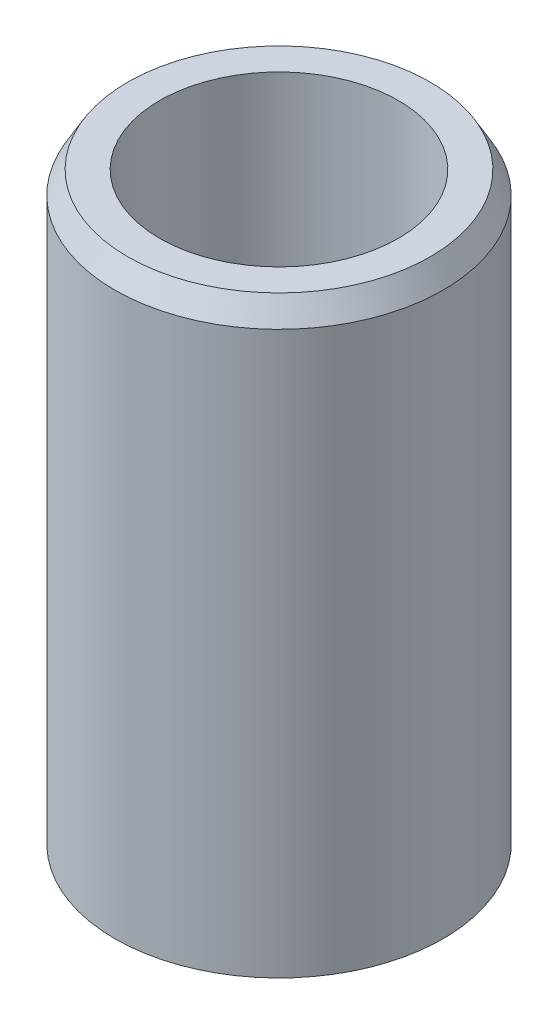
ISO-10303-21;
HEADER;
FILE_DESCRIPTION(('STEP AP214'),'2;1');
FILE_NAME('part.step','',(''),(''),'','','');
FILE_SCHEMA(('AUTOMOTIVE_DESIGN { 1 0 10303 214 1 1 1 1 }'));
ENDSEC;
DATA;
#1=APPLICATION_CONTEXT('core data for automotive mechanical design processes');
#2=APPLICATION_PROTOCOL_DEFINITION('international standard','automotive_design',2000,#1);
#3=PRODUCT_CONTEXT('',#1,'mechanical');
#4=PRODUCT('Part','Part','',(#3));
#5=PRODUCT_RELATED_PRODUCT_CATEGORY('part','',(#4));
#6=PRODUCT_DEFINITION_FORMATION('','',#4);
#7=PRODUCT_DEFINITION_CONTEXT('part definition',#1,'design');
#8=PRODUCT_DEFINITION('design','',#6,#7);
#9=PRODUCT_DEFINITION_SHAPE('','',#8);
#10=(LENGTH_UNIT() NAMED_UNIT(*) SI_UNIT(.MILLI.,.METRE.));
#11=(NAMED_UNIT(*) PLANE_ANGLE_UNIT() SI_UNIT($,.RADIAN.));
#12=(NAMED_UNIT(*) SI_UNIT($,.STERADIAN.) SOLID_ANGLE_UNIT());
#13=UNCERTAINTY_MEASURE_WITH_UNIT(LENGTH_MEASURE(1.E-05),#10,'distance_accuracy_value','');
#14=(GEOMETRIC_REPRESENTATION_CONTEXT(3) GLOBAL_UNCERTAINTY_ASSIGNED_CONTEXT((#13)) GLOBAL_UNIT_ASSIGNED_CONTEXT((#10,
#11,#12)) REPRESENTATION_CONTEXT('',''));
#15=CARTESIAN_POINT('',(0.,0.,0.));
#16=DIRECTION('',(0.,0.,1.));
#17=DIRECTION('',(1.,0.,0.));
#18=AXIS2_PLACEMENT_3D('',#15,#16,#17);
#19=CARTESIAN_POINT('',(0.,80.,0.));
#20=DIRECTION('',(0.,1.,0.));
#21=DIRECTION('',(0.,0.,1.));
#22=AXIS2_PLACEMENT_3D('',#19,#20,#21);
#23=PLANE('',#22);
#24=CARTESIAN_POINT('',(0.,80.,0.));
#25=DIRECTION('',(0.,1.,0.));
#26=DIRECTION('',(0.,0.,1.));
#27=AXIS2_PLACEMENT_3D('',#24,#25,#26);
#28=CIRCLE('',#27,20.2679491924311);
#29=CARTESIAN_POINT('',(0.,80.,20.2679491924311));
#30=VERTEX_POINT('',#29);
#31=EDGE_CURVE('E10',#30,#30,#28,.T.);
#32=ORIENTED_EDGE('',*,*,#31,.T.);
#33=EDGE_LOOP('',(#32));
#34=FACE_BOUND('',#33,.T.);
#35=CARTESIAN_POINT('',(0.,80.,0.));
#36=DIRECTION('',(0.,1.,0.));
#37=DIRECTION('',(0.,0.,1.));
#38=AXIS2_PLACEMENT_3D('',#35,#36,#37);
#39=CIRCLE('',#38,16.);
#40=CARTESIAN_POINT('',(0.,80.,16.));
#41=VERTEX_POINT('',#40);
#42=EDGE_CURVE('E61',#41,#41,#39,.T.);
#43=ORIENTED_EDGE('',*,*,#42,.F.);
#44=EDGE_LOOP('',(#43));
#45=FACE_BOUND('',#44,.T.);
#46=ADVANCED_FACE('F40',(#34,#45),#23,.T.);
#47=CARTESIAN_POINT('',(0.,0.,0.));
#48=DIRECTION('',(0.,1.,0.));
#49=DIRECTION('',(0.,0.,1.));
#50=AXIS2_PLACEMENT_3D('',#47,#48,#49);
#51=PLANE('',#50);
#52=CARTESIAN_POINT('',(0.,0.,0.));
#53=DIRECTION('',(0.,1.,0.));
#54=DIRECTION('',(0.,0.,1.));
#55=AXIS2_PLACEMENT_3D('',#52,#53,#54);
#56=CIRCLE('',#55,19.);
#57=CARTESIAN_POINT('',(0.,0.,19.));
#58=VERTEX_POINT('',#57);
#59=EDGE_CURVE('E48',#58,#58,#56,.F.);
#60=ORIENTED_EDGE('',*,*,#59,.T.);
#61=EDGE_LOOP('',(#60));
#62=FACE_BOUND('',#61,.T.);
#63=CARTESIAN_POINT('',(0.,0.,0.));
#64=DIRECTION('',(0.,1.,0.));
#65=DIRECTION('',(0.,0.,1.));
#66=AXIS2_PLACEMENT_3D('',#63,#64,#65);
#67=CIRCLE('',#66,16.);
#68=CARTESIAN_POINT('',(0.,0.,16.));
#69=VERTEX_POINT('',#68);
#70=EDGE_CURVE('E62',#69,#69,#67,.T.);
#71=ORIENTED_EDGE('',*,*,#70,.T.);
#72=EDGE_LOOP('',(#71));
#73=FACE_BOUND('',#72,.T.);
#74=ADVANCED_FACE('F72',(#62,#73),#51,.F.);
#75=CARTESIAN_POINT('',(0.,80.,0.));
#76=DIRECTION('',(0.,-1.,0.));
#77=DIRECTION('',(0.,0.,-1.));
#78=AXIS2_PLACEMENT_3D('',#75,#76,#77);
#79=CYLINDRICAL_SURFACE('',#78,22.);
#80=CARTESIAN_POINT('',(0.,1.73205080756889,0.));
#81=DIRECTION('',(0.,1.,0.));
#82=DIRECTION('',(0.,0.,1.));
#83=AXIS2_PLACEMENT_3D('',#80,#81,#82);
#84=CIRCLE('',#83,22.);
#85=CARTESIAN_POINT('',(0.,1.73205080756889,22.));
#86=VERTEX_POINT('',#85);
#87=EDGE_CURVE('E52',#86,#86,#84,.T.);
#88=ORIENTED_EDGE('',*,*,#87,.T.);
#89=EDGE_LOOP('',(#88));
#90=FACE_BOUND('',#89,.T.);
#91=CARTESIAN_POINT('',(0.,77.,0.));
#92=DIRECTION('',(0.,1.,0.));
#93=DIRECTION('',(0.,0.,1.));
#94=AXIS2_PLACEMENT_3D('',#91,#92,#93);
#95=CIRCLE('',#94,22.);
#96=CARTESIAN_POINT('',(0.,77.,22.));
#97=VERTEX_POINT('',#96);
#98=EDGE_CURVE('E56',#97,#97,#95,.F.);
#99=ORIENTED_EDGE('',*,*,#98,.T.);
#100=EDGE_LOOP('',(#99));
#101=FACE_BOUND('',#100,.T.);
#102=ADVANCED_FACE('F78',(#90,#101),#79,.T.);
#103=CARTESIAN_POINT('',(0.,80.,0.));
#104=DIRECTION('',(0.,-1.,0.));
#105=DIRECTION('',(0.,0.,-1.));
#106=AXIS2_PLACEMENT_3D('',#103,#104,#105);
#107=CYLINDRICAL_SURFACE('',#106,16.);
#108=ORIENTED_EDGE('',*,*,#42,.T.);
#109=EDGE_LOOP('',(#108));
#110=FACE_BOUND('',#109,.T.);
#111=ORIENTED_EDGE('',*,*,#70,.F.);
#112=EDGE_LOOP('',(#111));
#113=FACE_BOUND('',#112,.T.);
#114=ADVANCED_FACE('F68',(#110,#113),#107,.F.);
#115=CARTESIAN_POINT('',(0.,1.73205080756889,0.));
#116=DIRECTION('',(0.,1.,0.));
#117=DIRECTION('',(0.,0.,1.));
#118=AXIS2_PLACEMENT_3D('',#115,#116,#117);
#119=CONICAL_SURFACE('',#118,22.,1.0471975511966);
#120=ORIENTED_EDGE('',*,*,#59,.F.);
#121=EDGE_LOOP('',(#120));
#122=FACE_BOUND('',#121,.T.);
#123=ORIENTED_EDGE('',*,*,#87,.F.);
#124=EDGE_LOOP('',(#123));
#125=FACE_BOUND('',#124,.T.);
#126=ADVANCED_FACE('F85',(#122,#125),#119,.T.);
#127=CARTESIAN_POINT('',(0.,80.,0.));
#128=DIRECTION('',(0.,-1.,0.));
#129=DIRECTION('',(0.,0.,-1.));
#130=AXIS2_PLACEMENT_3D('',#127,#128,#129);
#131=CONICAL_SURFACE('',#130,20.2679491924311,0.523598775598297);
#132=ORIENTED_EDGE('',*,*,#98,.F.);
#133=EDGE_LOOP('',(#132));
#134=FACE_BOUND('',#133,.T.);
#135=ORIENTED_EDGE('',*,*,#31,.F.);
#136=EDGE_LOOP('',(#135));
#137=FACE_BOUND('',#136,.T.);
#138=ADVANCED_FACE('F43',(#134,#137),#131,.T.);
#139=CLOSED_SHELL('',(#46,#74,#102,#114,#126,#138));
#140=MANIFOLD_SOLID_BREP('B2',#139);
#141=ADVANCED_BREP_SHAPE_REPRESENTATION('',(#18,#140),#14);
#142=SHAPE_DEFINITION_REPRESENTATION(#9,#141);
ENDSEC;
END-ISO-10303-21;
